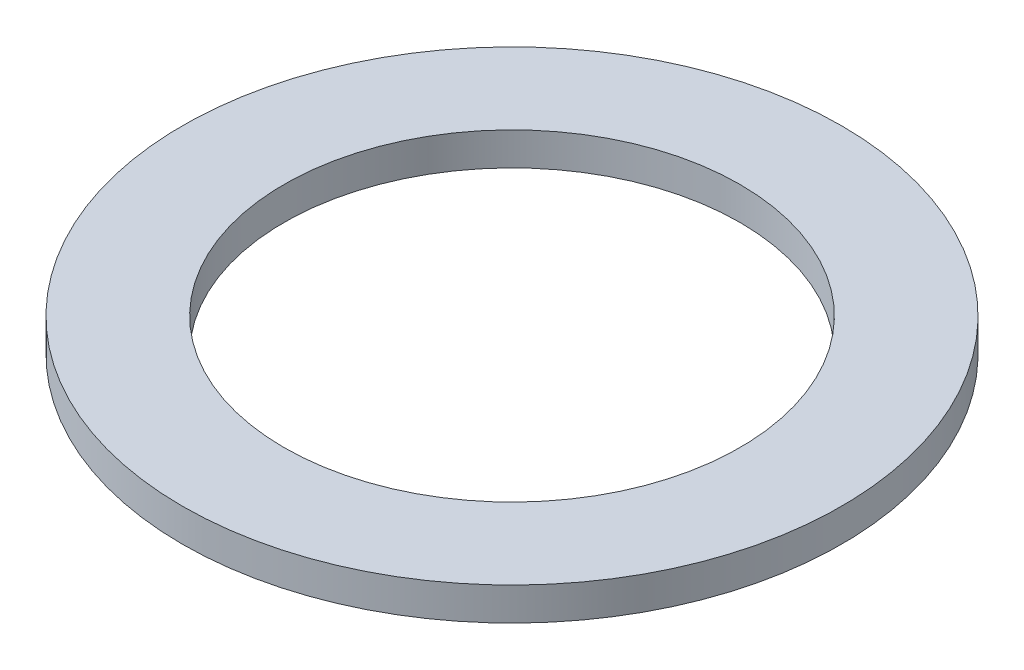
ISO-10303-21;
HEADER;
FILE_DESCRIPTION(('STEP AP214'),'2;1');
FILE_NAME('part.step','',(''),(''),'','','');
FILE_SCHEMA(('AUTOMOTIVE_DESIGN { 1 0 10303 214 1 1 1 1 }'));
ENDSEC;
DATA;
#1=APPLICATION_CONTEXT('core data for automotive mechanical design processes');
#2=APPLICATION_PROTOCOL_DEFINITION('international standard','automotive_design',2000,#1);
#3=PRODUCT_CONTEXT('',#1,'mechanical');
#4=PRODUCT('Part','Part','',(#3));
#5=PRODUCT_RELATED_PRODUCT_CATEGORY('part','',(#4));
#6=PRODUCT_DEFINITION_FORMATION('','',#4);
#7=PRODUCT_DEFINITION_CONTEXT('part definition',#1,'design');
#8=PRODUCT_DEFINITION('design','',#6,#7);
#9=PRODUCT_DEFINITION_SHAPE('','',#8);
#10=(LENGTH_UNIT() NAMED_UNIT(*) SI_UNIT(.MILLI.,.METRE.));
#11=(NAMED_UNIT(*) PLANE_ANGLE_UNIT() SI_UNIT($,.RADIAN.));
#12=(NAMED_UNIT(*) SI_UNIT($,.STERADIAN.) SOLID_ANGLE_UNIT());
#13=UNCERTAINTY_MEASURE_WITH_UNIT(LENGTH_MEASURE(1.E-05),#10,'distance_accuracy_value','');
#14=(GEOMETRIC_REPRESENTATION_CONTEXT(3) GLOBAL_UNCERTAINTY_ASSIGNED_CONTEXT((#13)) GLOBAL_UNIT_ASSIGNED_CONTEXT((#10,
#11,#12)) REPRESENTATION_CONTEXT('',''));
#15=CARTESIAN_POINT('',(0.,0.,0.));
#16=DIRECTION('',(0.,0.,1.));
#17=DIRECTION('',(1.,0.,0.));
#18=AXIS2_PLACEMENT_3D('',#15,#16,#17);
#19=CARTESIAN_POINT('',(0.,3.,0.));
#20=DIRECTION('',(0.,1.,0.));
#21=DIRECTION('',(0.,0.,1.));
#22=AXIS2_PLACEMENT_3D('',#19,#20,#21);
#23=PLANE('',#22);
#24=CARTESIAN_POINT('',(0.,3.,0.));
#25=DIRECTION('',(0.,1.,0.));
#26=DIRECTION('',(0.,0.,1.));
#27=AXIS2_PLACEMENT_3D('',#24,#25,#26);
#28=CIRCLE('',#27,30.);
#29=CARTESIAN_POINT('',(0.,3.,30.));
#30=VERTEX_POINT('',#29);
#31=EDGE_CURVE('E10',#30,#30,#28,.T.);
#32=ORIENTED_EDGE('',*,*,#31,.T.);
#33=EDGE_LOOP('',(#32));
#34=FACE_BOUND('',#33,.T.);
#35=CARTESIAN_POINT('',(0.,3.,0.));
#36=DIRECTION('',(0.,1.,0.));
#37=DIRECTION('',(0.,0.,1.));
#38=AXIS2_PLACEMENT_3D('',#35,#36,#37);
#39=CIRCLE('',#38,20.75);
#40=CARTESIAN_POINT('',(0.,3.,20.75));
#41=VERTEX_POINT('',#40);
#42=EDGE_CURVE('E50',#41,#41,#39,.T.);
#43=ORIENTED_EDGE('',*,*,#42,.F.);
#44=EDGE_LOOP('',(#43));
#45=FACE_BOUND('',#44,.T.);
#46=ADVANCED_FACE('F37',(#34,#45),#23,.T.);
#47=CARTESIAN_POINT('',(0.,0.,0.));
#48=DIRECTION('',(0.,1.,0.));
#49=DIRECTION('',(0.,0.,1.));
#50=AXIS2_PLACEMENT_3D('',#47,#48,#49);
#51=PLANE('',#50);
#52=CARTESIAN_POINT('',(0.,0.,0.));
#53=DIRECTION('',(0.,1.,0.));
#54=DIRECTION('',(0.,0.,1.));
#55=AXIS2_PLACEMENT_3D('',#52,#53,#54);
#56=CIRCLE('',#55,30.);
#57=CARTESIAN_POINT('',(0.,0.,30.));
#58=VERTEX_POINT('',#57);
#59=EDGE_CURVE('E41',#58,#58,#56,.T.);
#60=ORIENTED_EDGE('',*,*,#59,.F.);
#61=EDGE_LOOP('',(#60));
#62=FACE_BOUND('',#61,.T.);
#63=CARTESIAN_POINT('',(0.,0.,0.));
#64=DIRECTION('',(0.,1.,0.));
#65=DIRECTION('',(0.,0.,1.));
#66=AXIS2_PLACEMENT_3D('',#63,#64,#65);
#67=CIRCLE('',#66,20.75);
#68=CARTESIAN_POINT('',(0.,0.,20.75));
#69=VERTEX_POINT('',#68);
#70=EDGE_CURVE('E52',#69,#69,#67,.T.);
#71=ORIENTED_EDGE('',*,*,#70,.T.);
#72=EDGE_LOOP('',(#71));
#73=FACE_BOUND('',#72,.T.);
#74=ADVANCED_FACE('F64',(#62,#73),#51,.F.);
#75=CARTESIAN_POINT('',(0.,3.,0.));
#76=DIRECTION('',(0.,-1.,0.));
#77=DIRECTION('',(0.,0.,-1.));
#78=AXIS2_PLACEMENT_3D('',#75,#76,#77);
#79=CYLINDRICAL_SURFACE('',#78,30.);
#80=ORIENTED_EDGE('',*,*,#31,.F.);
#81=EDGE_LOOP('',(#80));
#82=FACE_BOUND('',#81,.T.);
#83=ORIENTED_EDGE('',*,*,#59,.T.);
#84=EDGE_LOOP('',(#83));
#85=FACE_BOUND('',#84,.T.);
#86=ADVANCED_FACE('F39',(#82,#85),#79,.T.);
#87=CARTESIAN_POINT('',(0.,3.,0.));
#88=DIRECTION('',(0.,-1.,0.));
#89=DIRECTION('',(0.,0.,-1.));
#90=AXIS2_PLACEMENT_3D('',#87,#88,#89);
#91=CYLINDRICAL_SURFACE('',#90,20.75);
#92=ORIENTED_EDGE('',*,*,#42,.T.);
#93=EDGE_LOOP('',(#92));
#94=FACE_BOUND('',#93,.T.);
#95=ORIENTED_EDGE('',*,*,#70,.F.);
#96=EDGE_LOOP('',(#95));
#97=FACE_BOUND('',#96,.T.);
#98=ADVANCED_FACE('F60',(#94,#97),#91,.F.);
#99=CLOSED_SHELL('',(#46,#74,#86,#98));
#100=MANIFOLD_SOLID_BREP('B2',#99);
#101=ADVANCED_BREP_SHAPE_REPRESENTATION('',(#18,#100),#14);
#102=SHAPE_DEFINITION_REPRESENTATION(#9,#101);
ENDSEC;
END-ISO-10303-21;
